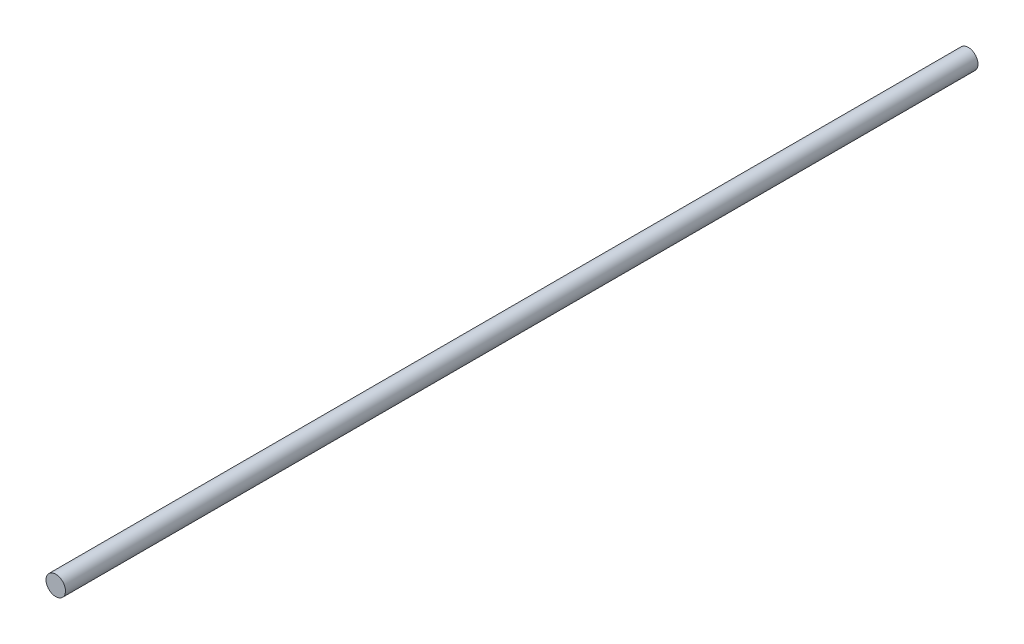
ISO-10303-21;
HEADER;
FILE_DESCRIPTION(('STEP AP214'),'2;1');
FILE_NAME('part.step','',(''),(''),'','','');
FILE_SCHEMA(('AUTOMOTIVE_DESIGN { 1 0 10303 214 1 1 1 1 }'));
ENDSEC;
DATA;
#1=APPLICATION_CONTEXT('core data for automotive mechanical design processes');
#2=APPLICATION_PROTOCOL_DEFINITION('international standard','automotive_design',2000,#1);
#3=PRODUCT_CONTEXT('',#1,'mechanical');
#4=PRODUCT('Part','Part','',(#3));
#5=PRODUCT_RELATED_PRODUCT_CATEGORY('part','',(#4));
#6=PRODUCT_DEFINITION_FORMATION('','',#4);
#7=PRODUCT_DEFINITION_CONTEXT('part definition',#1,'design');
#8=PRODUCT_DEFINITION('design','',#6,#7);
#9=PRODUCT_DEFINITION_SHAPE('','',#8);
#10=(LENGTH_UNIT() NAMED_UNIT(*) SI_UNIT(.MILLI.,.METRE.));
#11=(NAMED_UNIT(*) PLANE_ANGLE_UNIT() SI_UNIT($,.RADIAN.));
#12=(NAMED_UNIT(*) SI_UNIT($,.STERADIAN.) SOLID_ANGLE_UNIT());
#13=UNCERTAINTY_MEASURE_WITH_UNIT(LENGTH_MEASURE(1.E-05),#10,'distance_accuracy_value','');
#14=(GEOMETRIC_REPRESENTATION_CONTEXT(3) GLOBAL_UNCERTAINTY_ASSIGNED_CONTEXT((#13)) GLOBAL_UNIT_ASSIGNED_CONTEXT((#10,
#11,#12)) REPRESENTATION_CONTEXT('',''));
#15=CARTESIAN_POINT('',(0.,0.,0.));
#16=DIRECTION('',(0.,0.,1.));
#17=DIRECTION('',(1.,0.,0.));
#18=AXIS2_PLACEMENT_3D('',#15,#16,#17);
#19=CARTESIAN_POINT('',(0.,0.,421.64));
#20=DIRECTION('',(0.,0.,-1.));
#21=DIRECTION('',(-1.,0.,0.));
#22=AXIS2_PLACEMENT_3D('',#19,#20,#21);
#23=CYLINDRICAL_SURFACE('',#22,4.5);
#24=CARTESIAN_POINT('',(0.,0.,421.64));
#25=DIRECTION('',(0.,0.,1.));
#26=DIRECTION('',(1.,0.,0.));
#27=AXIS2_PLACEMENT_3D('',#24,#25,#26);
#28=CIRCLE('',#27,4.5);
#29=CARTESIAN_POINT('',(4.5,0.,421.64));
#30=VERTEX_POINT('',#29);
#31=EDGE_CURVE('E10',#30,#30,#28,.T.);
#32=ORIENTED_EDGE('',*,*,#31,.F.);
#33=EDGE_LOOP('',(#32));
#34=FACE_BOUND('',#33,.T.);
#35=CARTESIAN_POINT('',(0.,0.,0.));
#36=DIRECTION('',(0.,0.,1.));
#37=DIRECTION('',(1.,0.,0.));
#38=AXIS2_PLACEMENT_3D('',#35,#36,#37);
#39=CIRCLE('',#38,4.5);
#40=CARTESIAN_POINT('',(4.5,0.,0.));
#41=VERTEX_POINT('',#40);
#42=EDGE_CURVE('E44',#41,#41,#39,.T.);
#43=ORIENTED_EDGE('',*,*,#42,.T.);
#44=EDGE_LOOP('',(#43));
#45=FACE_BOUND('',#44,.T.);
#46=ADVANCED_FACE('F41',(#34,#45),#23,.T.);
#47=CARTESIAN_POINT('',(0.,0.,421.64));
#48=DIRECTION('',(0.,0.,1.));
#49=DIRECTION('',(1.,0.,0.));
#50=AXIS2_PLACEMENT_3D('',#47,#48,#49);
#51=PLANE('',#50);
#52=ORIENTED_EDGE('',*,*,#31,.T.);
#53=EDGE_LOOP('',(#52));
#54=FACE_BOUND('',#53,.T.);
#55=ADVANCED_FACE('F58',(#54),#51,.T.);
#56=CARTESIAN_POINT('',(0.,0.,0.));
#57=DIRECTION('',(0.,0.,1.));
#58=DIRECTION('',(1.,0.,0.));
#59=AXIS2_PLACEMENT_3D('',#56,#57,#58);
#60=PLANE('',#59);
#61=ORIENTED_EDGE('',*,*,#42,.F.);
#62=EDGE_LOOP('',(#61));
#63=FACE_BOUND('',#62,.T.);
#64=ADVANCED_FACE('F56',(#63),#60,.F.);
#65=CLOSED_SHELL('',(#46,#55,#64));
#66=MANIFOLD_SOLID_BREP('B2',#65);
#67=ADVANCED_BREP_SHAPE_REPRESENTATION('',(#18,#66),#14);
#68=SHAPE_DEFINITION_REPRESENTATION(#9,#67);
ENDSEC;
END-ISO-10303-21;
